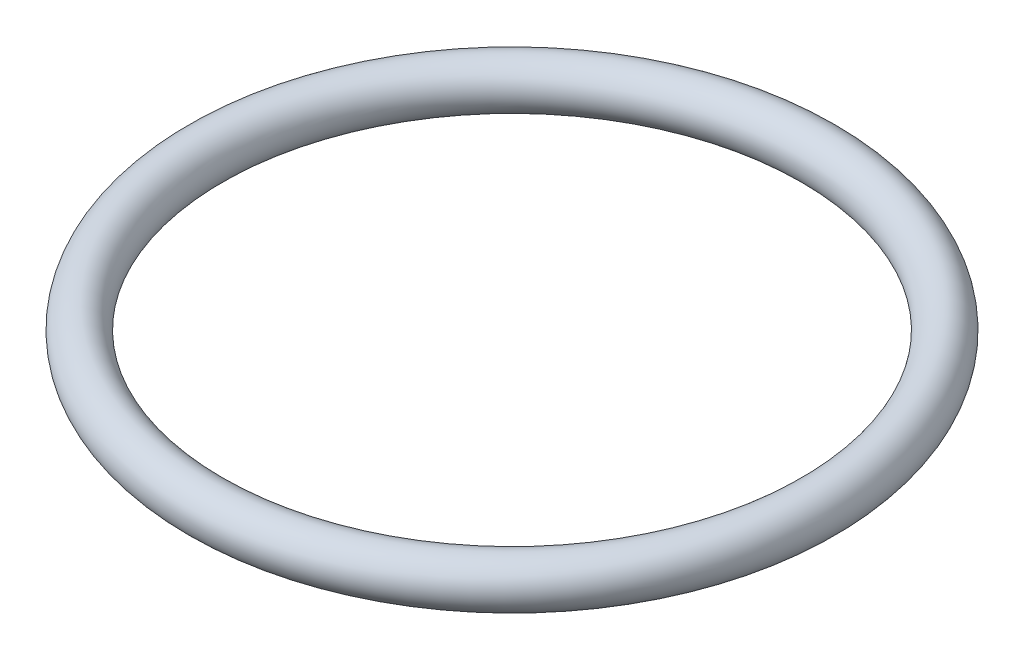
ISO-10303-21;
HEADER;
FILE_DESCRIPTION(('STEP AP214'),'2;1');
FILE_NAME('part.step','',(''),(''),'','','');
FILE_SCHEMA(('AUTOMOTIVE_DESIGN { 1 0 10303 214 1 1 1 1 }'));
ENDSEC;
DATA;
#1=APPLICATION_CONTEXT('core data for automotive mechanical design processes');
#2=APPLICATION_PROTOCOL_DEFINITION('international standard','automotive_design',2000,#1);
#3=PRODUCT_CONTEXT('',#1,'mechanical');
#4=PRODUCT('Part','Part','',(#3));
#5=PRODUCT_RELATED_PRODUCT_CATEGORY('part','',(#4));
#6=PRODUCT_DEFINITION_FORMATION('','',#4);
#7=PRODUCT_DEFINITION_CONTEXT('part definition',#1,'design');
#8=PRODUCT_DEFINITION('design','',#6,#7);
#9=PRODUCT_DEFINITION_SHAPE('','',#8);
#10=(LENGTH_UNIT() NAMED_UNIT(*) SI_UNIT(.MILLI.,.METRE.));
#11=(NAMED_UNIT(*) PLANE_ANGLE_UNIT() SI_UNIT($,.RADIAN.));
#12=(NAMED_UNIT(*) SI_UNIT($,.STERADIAN.) SOLID_ANGLE_UNIT());
#13=UNCERTAINTY_MEASURE_WITH_UNIT(LENGTH_MEASURE(1.E-05),#10,'distance_accuracy_value','');
#14=(GEOMETRIC_REPRESENTATION_CONTEXT(3) GLOBAL_UNCERTAINTY_ASSIGNED_CONTEXT((#13)) GLOBAL_UNIT_ASSIGNED_CONTEXT((#10,
#11,#12)) REPRESENTATION_CONTEXT('',''));
#15=CARTESIAN_POINT('',(0.,0.,0.));
#16=DIRECTION('',(0.,0.,1.));
#17=DIRECTION('',(1.,0.,0.));
#18=AXIS2_PLACEMENT_3D('',#15,#16,#17);
#19=CARTESIAN_POINT('',(0.,0.,0.));
#20=DIRECTION('',(0.,-1.,0.));
#21=DIRECTION('',(0.,0.,-1.));
#22=AXIS2_PLACEMENT_3D('',#19,#20,#21);
#23=TOROIDAL_SURFACE('',#22,13.,1.);
#24=CARTESIAN_POINT('',(0.,0.,-14.));
#25=VERTEX_POINT('',#24);
#26=VERTEX_LOOP('',#25);
#27=FACE_BOUND('',#26,.T.);
#28=ADVANCED_FACE('F28',(#27),#23,.T.);
#29=CLOSED_SHELL('',(#28));
#30=MANIFOLD_SOLID_BREP('B2',#29);
#31=ADVANCED_BREP_SHAPE_REPRESENTATION('',(#18,#30),#14);
#32=SHAPE_DEFINITION_REPRESENTATION(#9,#31);
ENDSEC;
END-ISO-10303-21;
